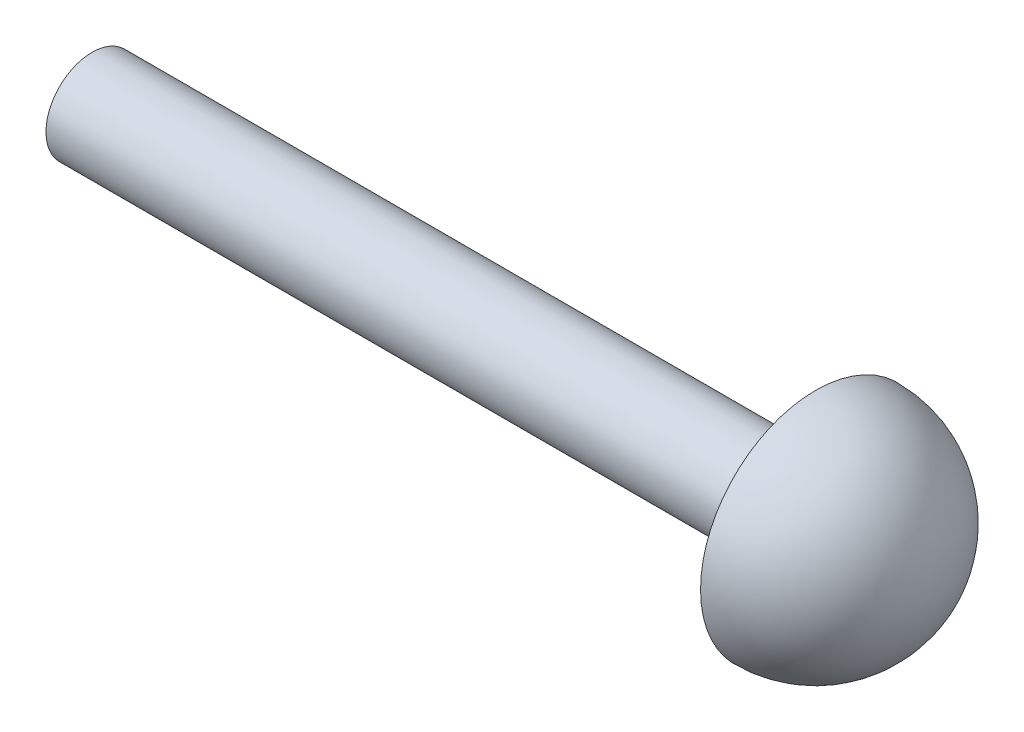
ISO-10303-21;
HEADER;
FILE_DESCRIPTION(('STEP AP214'),'2;1');
FILE_NAME('part.step','',(''),(''),'','','');
FILE_SCHEMA(('AUTOMOTIVE_DESIGN { 1 0 10303 214 1 1 1 1 }'));
ENDSEC;
DATA;
#1=APPLICATION_CONTEXT('core data for automotive mechanical design processes');
#2=APPLICATION_PROTOCOL_DEFINITION('international standard','automotive_design',2000,#1);
#3=PRODUCT_CONTEXT('',#1,'mechanical');
#4=PRODUCT('Part','Part','',(#3));
#5=PRODUCT_RELATED_PRODUCT_CATEGORY('part','',(#4));
#6=PRODUCT_DEFINITION_FORMATION('','',#4);
#7=PRODUCT_DEFINITION_CONTEXT('part definition',#1,'design');
#8=PRODUCT_DEFINITION('design','',#6,#7);
#9=PRODUCT_DEFINITION_SHAPE('','',#8);
#10=(LENGTH_UNIT() NAMED_UNIT(*) SI_UNIT(.MILLI.,.METRE.));
#11=(NAMED_UNIT(*) PLANE_ANGLE_UNIT() SI_UNIT($,.RADIAN.));
#12=(NAMED_UNIT(*) SI_UNIT($,.STERADIAN.) SOLID_ANGLE_UNIT());
#13=UNCERTAINTY_MEASURE_WITH_UNIT(LENGTH_MEASURE(1.E-05),#10,'distance_accuracy_value','');
#14=(GEOMETRIC_REPRESENTATION_CONTEXT(3) GLOBAL_UNCERTAINTY_ASSIGNED_CONTEXT((#13)) GLOBAL_UNIT_ASSIGNED_CONTEXT((#10,
#11,#12)) REPRESENTATION_CONTEXT('',''));
#15=CARTESIAN_POINT('',(0.,0.,0.));
#16=DIRECTION('',(0.,0.,1.));
#17=DIRECTION('',(1.,0.,0.));
#18=AXIS2_PLACEMENT_3D('',#15,#16,#17);
#19=CARTESIAN_POINT('',(0.,0.,0.));
#20=DIRECTION('',(-1.,0.,0.));
#21=DIRECTION('',(0.,1.,0.));
#22=AXIS2_PLACEMENT_3D('',#19,#20,#21);
#23=SPHERICAL_SURFACE('',#22,5.);
#24=CARTESIAN_POINT('',(0.,0.,0.));
#25=DIRECTION('',(-1.,0.,0.));
#26=DIRECTION('',(0.,0.,1.));
#27=AXIS2_PLACEMENT_3D('',#24,#25,#26);
#28=CIRCLE('',#27,5.);
#29=CARTESIAN_POINT('',(0.,0.,5.));
#30=VERTEX_POINT('',#29);
#31=EDGE_CURVE('E10',#30,#30,#28,.T.);
#32=ORIENTED_EDGE('',*,*,#31,.F.);
#33=EDGE_LOOP('',(#32));
#34=FACE_BOUND('',#33,.T.);
#35=ADVANCED_FACE('F31',(#34),#23,.T.);
#36=CARTESIAN_POINT('',(0.,5.,0.));
#37=DIRECTION('',(1.,0.,0.));
#38=DIRECTION('',(0.,0.,-1.));
#39=AXIS2_PLACEMENT_3D('',#36,#37,#38);
#40=PLANE('',#39);
#41=CARTESIAN_POINT('',(0.,0.,0.));
#42=DIRECTION('',(-1.,0.,0.));
#43=DIRECTION('',(0.,0.,1.));
#44=AXIS2_PLACEMENT_3D('',#41,#42,#43);
#45=CIRCLE('',#44,2.00000000000001);
#46=CARTESIAN_POINT('',(0.,0.,2.00000000000001));
#47=VERTEX_POINT('',#46);
#48=EDGE_CURVE('E37',#47,#47,#45,.T.);
#49=ORIENTED_EDGE('',*,*,#48,.F.);
#50=EDGE_LOOP('',(#49));
#51=FACE_BOUND('',#50,.T.);
#52=ORIENTED_EDGE('',*,*,#31,.T.);
#53=EDGE_LOOP('',(#52));
#54=FACE_BOUND('',#53,.T.);
#55=ADVANCED_FACE('F52',(#51,#54),#40,.F.);
#56=CARTESIAN_POINT('',(-31.4497816593886,0.,0.));
#57=DIRECTION('',(-1.,0.,0.));
#58=DIRECTION('',(0.,0.,1.));
#59=AXIS2_PLACEMENT_3D('',#56,#57,#58);
#60=CYLINDRICAL_SURFACE('',#59,2.);
#61=CARTESIAN_POINT('',(-31.4497816593886,0.,0.));
#62=DIRECTION('',(-1.,0.,0.));
#63=DIRECTION('',(0.,0.,1.));
#64=AXIS2_PLACEMENT_3D('',#61,#62,#63);
#65=CIRCLE('',#64,2.);
#66=CARTESIAN_POINT('',(-31.4497816593886,0.,2.));
#67=VERTEX_POINT('',#66);
#68=EDGE_CURVE('E41',#67,#67,#65,.T.);
#69=ORIENTED_EDGE('',*,*,#68,.F.);
#70=EDGE_LOOP('',(#69));
#71=FACE_BOUND('',#70,.T.);
#72=ORIENTED_EDGE('',*,*,#48,.T.);
#73=EDGE_LOOP('',(#72));
#74=FACE_BOUND('',#73,.T.);
#75=ADVANCED_FACE('F50',(#71,#74),#60,.T.);
#76=CARTESIAN_POINT('',(-31.4497816593886,2.,0.));
#77=DIRECTION('',(1.,0.,0.));
#78=DIRECTION('',(0.,0.,-1.));
#79=AXIS2_PLACEMENT_3D('',#76,#77,#78);
#80=PLANE('',#79);
#81=ORIENTED_EDGE('',*,*,#68,.T.);
#82=EDGE_LOOP('',(#81));
#83=FACE_BOUND('',#82,.T.);
#84=ADVANCED_FACE('F48',(#83),#80,.F.);
#85=CLOSED_SHELL('',(#35,#55,#75,#84));
#86=MANIFOLD_SOLID_BREP('B2',#85);
#87=ADVANCED_BREP_SHAPE_REPRESENTATION('',(#18,#86),#14);
#88=SHAPE_DEFINITION_REPRESENTATION(#9,#87);
ENDSEC;
END-ISO-10303-21;
